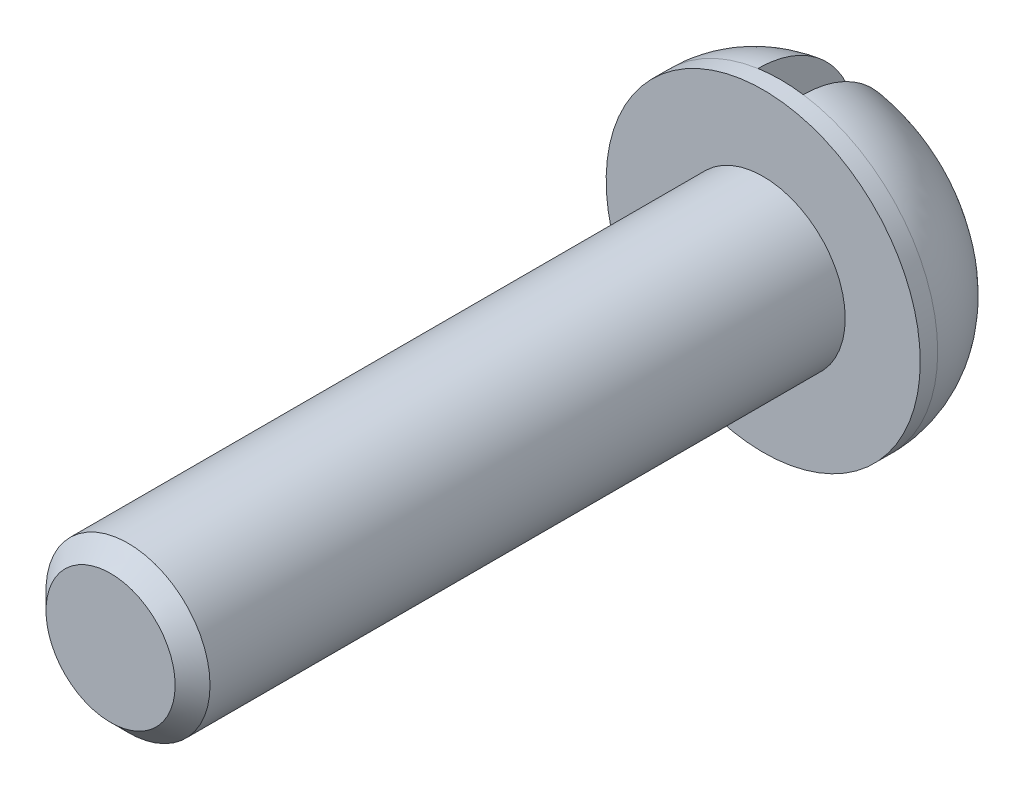
ISO-10303-21;
HEADER;
FILE_DESCRIPTION(('STEP AP214'),'2;1');
FILE_NAME('part.step','',(''),(''),'','','');
FILE_SCHEMA(('AUTOMOTIVE_DESIGN { 1 0 10303 214 1 1 1 1 }'));
ENDSEC;
DATA;
#1=APPLICATION_CONTEXT('core data for automotive mechanical design processes');
#2=APPLICATION_PROTOCOL_DEFINITION('international standard','automotive_design',2000,#1);
#3=PRODUCT_CONTEXT('',#1,'mechanical');
#4=PRODUCT('Part','Part','',(#3));
#5=PRODUCT_RELATED_PRODUCT_CATEGORY('part','',(#4));
#6=PRODUCT_DEFINITION_FORMATION('','',#4);
#7=PRODUCT_DEFINITION_CONTEXT('part definition',#1,'design');
#8=PRODUCT_DEFINITION('design','',#6,#7);
#9=PRODUCT_DEFINITION_SHAPE('','',#8);
#10=(LENGTH_UNIT() NAMED_UNIT(*) SI_UNIT(.MILLI.,.METRE.));
#11=(NAMED_UNIT(*) PLANE_ANGLE_UNIT() SI_UNIT($,.RADIAN.));
#12=(NAMED_UNIT(*) SI_UNIT($,.STERADIAN.) SOLID_ANGLE_UNIT());
#13=UNCERTAINTY_MEASURE_WITH_UNIT(LENGTH_MEASURE(1.E-05),#10,'distance_accuracy_value','');
#14=(GEOMETRIC_REPRESENTATION_CONTEXT(3) GLOBAL_UNCERTAINTY_ASSIGNED_CONTEXT((#13)) GLOBAL_UNIT_ASSIGNED_CONTEXT((#10,
#11,#12)) REPRESENTATION_CONTEXT('',''));
#15=CARTESIAN_POINT('',(0.,0.,0.));
#16=DIRECTION('',(0.,0.,1.));
#17=DIRECTION('',(1.,0.,0.));
#18=AXIS2_PLACEMENT_3D('',#15,#16,#17);
#19=CARTESIAN_POINT('',(0.,0.,0.));
#20=DIRECTION('',(0.,0.,1.));
#21=DIRECTION('',(1.,0.,0.));
#22=AXIS2_PLACEMENT_3D('',#19,#20,#21);
#23=PLANE('',#22);
#24=CARTESIAN_POINT('',(0.,0.,0.));
#25=DIRECTION('',(0.,0.,1.));
#26=DIRECTION('',(1.,0.,0.));
#27=AXIS2_PLACEMENT_3D('',#24,#25,#26);
#28=CIRCLE('',#27,1.7);
#29=CARTESIAN_POINT('',(-0.65,-1.5708278072405,0.));
#30=VERTEX_POINT('',#29);
#31=CARTESIAN_POINT('',(-0.65,1.5708278072405,0.));
#32=VERTEX_POINT('',#31);
#33=EDGE_CURVE('E100',#30,#32,#28,.F.);
#34=ORIENTED_EDGE('',*,*,#33,.T.);
#35=DIRECTION('',(0.,1.,0.));
#36=VECTOR('',#35,1.);
#37=CARTESIAN_POINT('',(-0.649999999999999,5.01710773037436,0.));
#38=LINE('',#37,#36);
#39=EDGE_CURVE('E90',#30,#32,#38,.T.);
#40=ORIENTED_EDGE('',*,*,#39,.F.);
#41=EDGE_LOOP('',(#34,#40));
#42=FACE_BOUND('',#41,.T.);
#43=ADVANCED_FACE('F45',(#42),#23,.F.);
#44=CARTESIAN_POINT('',(0.,0.,2.8));
#45=DIRECTION('',(0.,0.,1.));
#46=DIRECTION('',(1.,0.,0.));
#47=AXIS2_PLACEMENT_3D('',#44,#45,#46);
#48=DEGENERATE_TOROIDAL_SURFACE('',#47,1.7,2.8,.T.);
#49=CARTESIAN_POINT('',(-0.65,0.,0.204330529516518));
#50=CARTESIAN_POINT('',(-0.65,0.0279117837896374,0.204331087934366));
#51=CARTESIAN_POINT('',(-0.65,0.0558228971564562,0.203597110541377));
#52=CARTESIAN_POINT('',(-0.65,0.111575364540847,0.200734955072668));
#53=CARTESIAN_POINT('',(-0.65,0.139416708756462,0.198606591035097));
#54=CARTESIAN_POINT('',(-0.65,0.222849285232592,0.190391354619713));
#55=CARTESIAN_POINT('',(-0.65,0.278255780315076,0.182475354123906));
#56=CARTESIAN_POINT('',(-0.65,0.389405052110546,0.163770219803784));
#57=CARTESIAN_POINT('',(-0.65,0.445139999691246,0.152938972093485));
#58=CARTESIAN_POINT('',(-0.65,0.556417626954032,0.130466941404177));
#59=CARTESIAN_POINT('',(-0.65,0.611960375471304,0.11882648866782));
#60=CARTESIAN_POINT('',(-0.65,0.723233918642094,0.096077436262975));
#61=CARTESIAN_POINT('',(-0.65,0.77896486429416,0.0849695529680995));
#62=CARTESIAN_POINT('',(-0.65,0.890698592387891,0.0642013171293553));
#63=CARTESIAN_POINT('',(-0.65,0.946701358116122,0.0545408767218459));
#64=CARTESIAN_POINT('',(-0.65,1.05901660087995,0.0372616005583423));
#65=CARTESIAN_POINT('',(-0.65,1.11532901203785,0.0296423464750496));
#66=CARTESIAN_POINT('',(-0.65,1.22823025754123,0.0168393914026677));
#67=CARTESIAN_POINT('',(-0.65,1.28481909966129,0.0116557593181999));
#68=CARTESIAN_POINT('',(-0.649999999999999,1.45370229763085,0.00027211625048921));
#69=CARTESIAN_POINT('',(-0.65,1.56630309056038,-0.00195601816972203));
#70=CARTESIAN_POINT('',(-0.65,1.79114141144954,0.00554067481986287));
#71=CARTESIAN_POINT('',(-0.65,1.90337892249108,0.015266051099118));
#72=CARTESIAN_POINT('',(-0.65,2.09492538132553,0.0427167418326751));
#73=CARTESIAN_POINT('',(-0.649999999999999,2.17467039274206,0.0574465738207134));
#74=CARTESIAN_POINT('',(-0.649999999999999,2.33268200105975,0.0934145878866664));
#75=CARTESIAN_POINT('',(-0.649999999999999,2.41094830676893,0.114654037967693));
#76=CARTESIAN_POINT('',(-0.649999999999999,2.64324715184667,0.188304765014206));
#77=CARTESIAN_POINT('',(-0.649999999999999,2.7942929256106,0.250579913933112));
#78=CARTESIAN_POINT('',(-0.649999999999999,3.08348310789024,0.400022624468928));
#79=CARTESIAN_POINT('',(-0.649999999999999,3.22162540752624,0.487194245628106));
#80=CARTESIAN_POINT('',(-0.649999999999999,3.48063344120579,0.68398038974325));
#81=CARTESIAN_POINT('',(-0.649999999999999,3.60152202586923,0.79356475233629));
#82=CARTESIAN_POINT('',(-0.649999999999999,3.81958299652491,1.02898124095914));
#83=CARTESIAN_POINT('',(-0.649999999999999,3.91728542724759,1.1543229397608));
#84=CARTESIAN_POINT('',(-0.649999999999999,4.09000959206464,1.41982826511232));
#85=CARTESIAN_POINT('',(-0.649999999999999,4.16502506169916,1.55999597111359));
#86=CARTESIAN_POINT('',(-0.649999999999999,4.28936679221441,1.84938714379647));
#87=CARTESIAN_POINT('',(-0.649999999999999,4.33897752429503,1.99848846151491));
#88=CARTESIAN_POINT('',(-0.649999999999999,4.41234339605911,2.30290912318825));
#89=CARTESIAN_POINT('',(-0.649999999999999,4.43610137385542,2.45822778266266));
#90=CARTESIAN_POINT('',(-0.649999999999999,4.45703015449758,2.7700091908226));
#91=CARTESIAN_POINT('',(-0.649999999999999,4.45430863464563,2.92646472290166));
#92=CARTESIAN_POINT('',(-0.649999999999999,4.42261766872882,3.23668758234763));
#93=CARTESIAN_POINT('',(-0.649999999999999,4.39364941434615,3.39045503143866));
#94=CARTESIAN_POINT('',(-0.649999999999999,4.31034132645346,3.69082754898661));
#95=CARTESIAN_POINT('',(-0.649999999999999,4.25602082394701,3.83743798072508));
#96=CARTESIAN_POINT('',(-0.649999999999999,4.12357775281915,4.11951641704203));
#97=CARTESIAN_POINT('',(-0.649999999999999,4.04545013210249,4.25498204883217));
#98=CARTESIAN_POINT('',(-0.649999999999999,3.86743713578594,4.51127299241697));
#99=CARTESIAN_POINT('',(-0.649999999999999,3.76749755087739,4.63206063934133));
#100=CARTESIAN_POINT('',(-0.649999999999999,3.54894900878556,4.85518744521845));
#101=CARTESIAN_POINT('',(-0.649999999999999,3.43035335282762,4.9575396374253));
#102=CARTESIAN_POINT('',(-0.649999999999999,3.17710133722307,5.14174949027032));
#103=CARTESIAN_POINT('',(-0.649999999999999,3.04235071858958,5.22347728116295));
#104=CARTESIAN_POINT('',(-0.649999999999999,2.76087650725441,5.36375822882419));
#105=CARTESIAN_POINT('',(-0.649999999999999,2.61412863889647,5.42226292177923));
#106=CARTESIAN_POINT('',(-0.649999999999999,2.38705074607265,5.49205937434418));
#107=CARTESIAN_POINT('',(-0.649999999999999,2.30939114839431,5.51244097602119));
#108=CARTESIAN_POINT('',(-0.649999999999999,2.1526771745104,5.54681993477708));
#109=CARTESIAN_POINT('',(-0.65,2.07362321099464,5.5608191489761));
#110=CARTESIAN_POINT('',(-0.65,1.91503056711211,5.58244002672942));
#111=CARTESIAN_POINT('',(-0.65,1.83549580972397,5.59009083636058));
#112=CARTESIAN_POINT('',(-0.65,1.67609799062975,5.59930257984155));
#113=CARTESIAN_POINT('',(-0.65,1.59623500959051,5.60086492978602));
#114=CARTESIAN_POINT('',(-0.65,1.43959066671686,5.59828619412824));
#115=CARTESIAN_POINT('',(-0.65,1.3628053902994,5.59435551211281));
#116=CARTESIAN_POINT('',(-0.65,1.20968432344499,5.58166418880198));
#117=CARTESIAN_POINT('',(-0.65,1.13334833613665,5.57290585148777));
#118=CARTESIAN_POINT('',(-0.65,0.981018168726281,5.5513459538168));
#119=CARTESIAN_POINT('',(-0.65,0.9050258644384,5.53853154314831));
#120=CARTESIAN_POINT('',(-0.65,0.753433020233272,5.51021024306605));
#121=CARTESIAN_POINT('',(-0.65,0.677833384505429,5.4946987380632));
#122=CARTESIAN_POINT('',(-0.65,0.564176676143863,5.47124790715525));
#123=CARTESIAN_POINT('',(-0.65,0.526106829773408,5.46337086573171));
#124=CARTESIAN_POINT('',(-0.65,0.449877912792236,5.44807647256468));
#125=CARTESIAN_POINT('',(-0.65,0.411718833890828,5.44065916545218));
#126=CARTESIAN_POINT('',(-0.65,0.297233474050782,5.4200934973403));
#127=CARTESIAN_POINT('',(-0.65,0.220555420428561,5.40854924859761));
#128=CARTESIAN_POINT('',(-0.65,0.104710806565111,5.39862217403233));
#129=CARTESIAN_POINT('',(-0.65,0.0658833020309873,5.3965478376567));
#130=CARTESIAN_POINT('',(-0.65,-0.0118156181124019,5.39524558825786));
#131=CARTESIAN_POINT('',(-0.65,-0.0506870263295294,5.39601725181112));
#132=CARTESIAN_POINT('',(-0.65,-0.128429900278693,5.40027292117363));
#133=CARTESIAN_POINT('',(-0.65,-0.167300730895887,5.40376788003507));
#134=CARTESIAN_POINT('',(-0.65,-0.244791377715604,5.41290679467957));
#135=CARTESIAN_POINT('',(-0.65,-0.28341109314006,5.4185515648908));
#136=CARTESIAN_POINT('',(-0.65,-0.392359721227225,5.43648935259769));
#137=CARTESIAN_POINT('',(-0.65,-0.462405675745249,5.45041202969674));
#138=CARTESIAN_POINT('',(-0.65,-0.602330290887419,5.47902438193602));
#139=CARTESIAN_POINT('',(-0.65,-0.672208911370984,5.49371422493339));
#140=CARTESIAN_POINT('',(-0.65,-0.812191590209405,5.52146708493826));
#141=CARTESIAN_POINT('',(-0.65,-0.882295107999363,5.53453267069043));
#142=CARTESIAN_POINT('',(-0.65,-1.02299077260088,5.55767447265196));
#143=CARTESIAN_POINT('',(-0.65,-1.09358279848025,5.56775140340544));
#144=CARTESIAN_POINT('',(-0.65,-1.23464844805872,5.58401394702837));
#145=CARTESIAN_POINT('',(-0.65,-1.30511843589948,5.59023028489063));
#146=CARTESIAN_POINT('',(-0.65,-1.44632144043651,5.59838476206285));
#147=CARTESIAN_POINT('',(-0.65,-1.51705448688793,5.60032240168588));
#148=CARTESIAN_POINT('',(-0.65,-1.65860196223128,5.59958933103074));
#149=CARTESIAN_POINT('',(-0.65,-1.72941636688346,5.59691218356284));
#150=CARTESIAN_POINT('',(-0.65,-1.87069757192823,5.58673580669473));
#151=CARTESIAN_POINT('',(-0.65,-1.94116437814897,5.57923665842343));
#152=CARTESIAN_POINT('',(-0.65,-2.09049340011581,5.55800711036983));
#153=CARTESIAN_POINT('',(-0.65,-2.16926080637245,5.54359540904285));
#154=CARTESIAN_POINT('',(-0.65,-2.32526739618395,5.50844787320665));
#155=CARTESIAN_POINT('',(-0.65,-2.40250802440952,5.48771835507101));
#156=CARTESIAN_POINT('',(-0.65,-2.63317056294659,5.4154488361604));
#157=CARTESIAN_POINT('',(-0.65,-2.78365823997052,5.35408845072101));
#158=CARTESIAN_POINT('',(-0.65,-3.0716602423947,5.20685270163376));
#159=CARTESIAN_POINT('',(-0.65,-3.20920041958005,5.1210276287806));
#160=CARTESIAN_POINT('',(-0.65,-3.46692156581066,4.92753363022395));
#161=CARTESIAN_POINT('',(-0.65,-3.58718524694266,4.81997515312549));
#162=CARTESIAN_POINT('',(-0.65,-3.80577883649485,4.58758994399158));
#163=CARTESIAN_POINT('',(-0.65,-3.90441427808099,4.46305045607964));
#164=CARTESIAN_POINT('',(-0.65,-4.07925126881427,4.19881518613118));
#165=CARTESIAN_POINT('',(-0.65,-4.15541729244024,4.05909587597104));
#166=CARTESIAN_POINT('',(-0.65,-4.28204630159045,3.77047360593635));
#167=CARTESIAN_POINT('',(-0.65,-4.33280794886233,3.62170159644235));
#168=CARTESIAN_POINT('',(-0.65,-4.40849150531023,3.31779997918635));
#169=CARTESIAN_POINT('',(-0.65,-4.43342650205663,3.16267363293593));
#170=CARTESIAN_POINT('',(-0.65,-4.4567218846325,2.85107244616185));
#171=CARTESIAN_POINT('',(-0.65,-4.45518943830652,2.69460560652868));
#172=CARTESIAN_POINT('',(-0.65,-4.4258557153541,2.38413551909046));
#173=CARTESIAN_POINT('',(-0.65,-4.39805143342681,2.2301325551839));
#174=CARTESIAN_POINT('',(-0.65,-4.31701099744031,1.92910295750259));
#175=CARTESIAN_POINT('',(-0.65,-4.26379492623196,1.78207091532762));
#176=CARTESIAN_POINT('',(-0.65,-4.13348552775416,1.49900569277873));
#177=CARTESIAN_POINT('',(-0.65,-4.05639270873031,1.36297227836337));
#178=CARTESIAN_POINT('',(-0.65,-3.8803671284891,1.10541606456842));
#179=CARTESIAN_POINT('',(-0.65,-3.78138604381101,0.983926302988356));
#180=CARTESIAN_POINT('',(-0.65,-3.5645553620557,0.75916860268908));
#181=CARTESIAN_POINT('',(-0.65,-3.44670685834014,0.655899608809962));
#182=CARTESIAN_POINT('',(-0.65,-3.19473731500021,0.469719759068232));
#183=CARTESIAN_POINT('',(-0.65,-3.06051541726674,0.386945690982017));
#184=CARTESIAN_POINT('',(-0.65,-2.78013937877912,0.24464347405776));
#185=CARTESIAN_POINT('',(-0.65,-2.63398016830355,0.185125264595288));
#186=CARTESIAN_POINT('',(-0.65,-2.40773053086942,0.113762414740906));
#187=CARTESIAN_POINT('',(-0.65,-2.33037662368006,0.0928504515872156));
#188=CARTESIAN_POINT('',(-0.65,-2.17423016064795,0.0573863519268674));
#189=CARTESIAN_POINT('',(-0.65,-2.09543803413488,0.0428323488038696));
#190=CARTESIAN_POINT('',(-0.65,-1.93710907518408,0.0200586793184042));
#191=CARTESIAN_POINT('',(-0.65,-1.85757396298509,0.0118269050165051));
#192=CARTESIAN_POINT('',(-0.65,-1.69813173729819,0.00148527811640662));
#193=CARTESIAN_POINT('',(-0.65,-1.61822473386984,-0.000626283034067639));
#194=CARTESIAN_POINT('',(-0.65,-1.47391075968334,0.000794936248612849));
#195=CARTESIAN_POINT('',(-0.65,-1.40949030611767,0.00331651922976186));
#196=CARTESIAN_POINT('',(-0.65,-1.28088761647228,0.01185989054035));
#197=CARTESIAN_POINT('',(-0.65,-1.21670537228828,0.0178815586719182));
#198=CARTESIAN_POINT('',(-0.65,-1.08836543453608,0.0330587123296681));
#199=CARTESIAN_POINT('',(-0.65,-1.02420978962779,0.0422311342191122));
#200=CARTESIAN_POINT('',(-0.65,-0.896329220916162,0.0630650966075091));
#201=CARTESIAN_POINT('',(-0.65,-0.832604204598304,0.0747260837212804));
#202=CARTESIAN_POINT('',(-0.65,-0.704844825132041,0.0996569261489211));
#203=CARTESIAN_POINT('',(-0.65,-0.640813352262589,0.112941132372526));
#204=CARTESIAN_POINT('',(-0.65,-0.51265890642737,0.139384927081313));
#205=CARTESIAN_POINT('',(-0.65,-0.448535908021505,0.15254436992915));
#206=CARTESIAN_POINT('',(-0.65,-0.320628561545134,0.175853199198758));
#207=CARTESIAN_POINT('',(-0.65,-0.256852549491517,0.186043054816712));
#208=CARTESIAN_POINT('',(-0.65,-0.160728738253536,0.196757182513252));
#209=CARTESIAN_POINT('',(-0.65,-0.128647304162951,0.199566179812943));
#210=CARTESIAN_POINT('',(-0.65,-0.0643769383673947,0.203352394893405));
#211=CARTESIAN_POINT('',(-0.65,-0.0321880233917454,0.204329885545967));
#212=CARTESIAN_POINT('',(-0.65,0.,0.204330529516518));
#213=B_SPLINE_CURVE_WITH_KNOTS('',3,(#49,#50,#51,#52,#53,#54,#55,#56,#57,#58,#59,#60,#61,#62,
#63,#64,#65,#66,#67,#68,#69,#70,#71,#72,#73,#74,#75,#76,#77,#78,#79,#80,#81,#82,#83,#84,#85,#86,
#87,#88,#89,#90,#91,#92,#93,#94,#95,#96,#97,#98,#99,#100,#101,#102,#103,#104,#105,#106,#107,
#108,#109,#110,#111,#112,#113,#114,#115,#116,#117,#118,#119,#120,#121,#122,#123,#124,#125,#126,
#127,#128,#129,#130,#131,#132,#133,#134,#135,#136,#137,#138,#139,#140,#141,#142,#143,#144,#145,
#146,#147,#148,#149,#150,#151,#152,#153,#154,#155,#156,#157,#158,#159,#160,#161,#162,#163,#164,
#165,#166,#167,#168,#169,#170,#171,#172,#173,#174,#175,#176,#177,#178,#179,#180,#181,#182,#183,
#184,#185,#186,#187,#188,#189,#190,#191,#192,#193,#194,#195,#196,#197,#198,#199,#200,#201,#202,
#203,#204,#205,#206,#207,#208,#209,#210,#211,#212),.UNSPECIFIED.,.T.,.F.,(4,2,2,2,2,2,2,2,2,2,2,
2,2,2,2,2,2,2,2,2,2,2,2,2,2,2,2,2,2,2,2,2,2,2,2,2,2,2,2,2,2,2,2,2,2,2,2,2,2,2,2,2,2,2,2,2,2,2,2,
2,2,2,2,2,2,2,2,2,2,2,2,2,2,2,2,2,2,2,2,2,2,4),(0.,0.0837252526420583,0.167461673544681,
0.335213226754073,0.505531888994438,0.675781446407129,0.846253930806523,1.01671606287576,
1.18714323311481,1.35757522450948,1.69483598625099,2.03211223457649,2.2751260238936,
2.51818717978259,3.00576570975314,3.4934237882152,3.98042990270964,4.4549092701746,
4.92951953436033,5.39869225449552,5.86781346369708,6.33502781927595,6.80222096295391,
7.26905845397962,7.73599508140094,8.20410567699579,8.67188402377214,9.14253828617038,
9.61416964772726,9.85481743526719,10.0953951553702,10.3348621534584,10.5742734513867,
10.8047616018187,11.0351398477269,11.2662554012872,11.4977704315665,11.6143945856016,
11.7310300438269,11.9632407116654,12.0797906587688,12.1963232664482,12.3133270010746,
12.4303751052118,12.6445603811045,12.8587927190469,13.0726818202364,13.2865197423392,
13.4986332359242,13.7107714998318,13.9232059159823,14.1356367580725,14.3755831926812,
14.6152905182553,15.100315414871,15.5843503733931,16.0659846963764,16.5403001396387,
17.0153615341079,17.4846984460279,17.953797406474,18.4209974114255,18.8882508670229,
19.3551356634036,19.8220105222569,20.2899265938076,20.7578155595608,21.2287478898892,
21.6998812735013,21.9400531280347,22.180154423696,22.4197947376911,22.6593681459352,
22.8526794249366,23.0459840657477,23.2403444797859,23.4346617186213,23.6308416605635,
23.8272277752196,24.0207968896553,24.1173637023255,24.2139161265931),.UNSPECIFIED.);
#214=CARTESIAN_POINT('',(-0.649999999999999,4.45280810275943,2.8));
#215=VERTEX_POINT('',#214);
#216=EDGE_CURVE('E96',#32,#215,#213,.T.);
#217=ORIENTED_EDGE('',*,*,#216,.F.);
#218=ORIENTED_EDGE('',*,*,#33,.F.);
#219=CARTESIAN_POINT('',(-0.65,-4.45280810275943,2.8));
#220=VERTEX_POINT('',#219);
#221=EDGE_CURVE('E87',#220,#30,#213,.T.);
#222=ORIENTED_EDGE('',*,*,#221,.F.);
#223=CARTESIAN_POINT('',(0.,0.,2.8));
#224=DIRECTION('',(0.,0.,1.));
#225=DIRECTION('',(1.,0.,0.));
#226=AXIS2_PLACEMENT_3D('',#223,#224,#225);
#227=CIRCLE('',#226,4.5);
#228=EDGE_CURVE('E282',#215,#220,#227,.T.);
#229=ORIENTED_EDGE('',*,*,#228,.F.);
#230=EDGE_LOOP('',(#217,#218,#222,#229));
#231=FACE_BOUND('',#230,.T.);
#232=ADVANCED_FACE('F103',(#231),#48,.T.);
#233=CARTESIAN_POINT('',(0.,0.,3.3));
#234=DIRECTION('',(0.,0.,-1.));
#235=DIRECTION('',(-1.,0.,0.));
#236=AXIS2_PLACEMENT_3D('',#233,#234,#235);
#237=CYLINDRICAL_SURFACE('',#236,4.5);
#238=CARTESIAN_POINT('',(0.650000000000001,4.45280810275943,2.8));
#239=VERTEX_POINT('',#238);
#240=EDGE_CURVE('E109',#239,#215,#227,.T.);
#241=ORIENTED_EDGE('',*,*,#240,.T.);
#242=ORIENTED_EDGE('',*,*,#228,.T.);
#243=CARTESIAN_POINT('',(0.65,-4.45280810275943,2.8));
#244=VERTEX_POINT('',#243);
#245=EDGE_CURVE('E284',#220,#244,#227,.T.);
#246=ORIENTED_EDGE('',*,*,#245,.T.);
#247=EDGE_CURVE('E287',#244,#239,#227,.T.);
#248=ORIENTED_EDGE('',*,*,#247,.T.);
#249=EDGE_LOOP('',(#241,#242,#246,#248));
#250=FACE_BOUND('',#249,.T.);
#251=CARTESIAN_POINT('',(0.,0.,3.3));
#252=DIRECTION('',(0.,0.,1.));
#253=DIRECTION('',(1.,0.,0.));
#254=AXIS2_PLACEMENT_3D('',#251,#252,#253);
#255=CIRCLE('',#254,4.5);
#256=CARTESIAN_POINT('',(4.5,0.,3.3));
#257=VERTEX_POINT('',#256);
#258=EDGE_CURVE('E288',#257,#257,#255,.T.);
#259=ORIENTED_EDGE('',*,*,#258,.F.);
#260=EDGE_LOOP('',(#259));
#261=FACE_BOUND('',#260,.T.);
#262=ADVANCED_FACE('F143',(#250,#261),#237,.T.);
#263=CARTESIAN_POINT('',(0.,0.,3.3));
#264=DIRECTION('',(0.,0.,1.));
#265=DIRECTION('',(1.,0.,0.));
#266=AXIS2_PLACEMENT_3D('',#263,#264,#265);
#267=PLANE('',#266);
#268=CARTESIAN_POINT('',(0.,0.,3.3));
#269=DIRECTION('',(0.,0.,1.));
#270=DIRECTION('',(1.,0.,0.));
#271=AXIS2_PLACEMENT_3D('',#268,#269,#270);
#272=CIRCLE('',#271,2.35);
#273=CARTESIAN_POINT('',(2.35,0.,3.3));
#274=VERTEX_POINT('',#273);
#275=EDGE_CURVE('E290',#274,#274,#272,.F.);
#276=ORIENTED_EDGE('',*,*,#275,.T.);
#277=EDGE_LOOP('',(#276));
#278=FACE_BOUND('',#277,.T.);
#279=ORIENTED_EDGE('',*,*,#258,.T.);
#280=EDGE_LOOP('',(#279));
#281=FACE_BOUND('',#280,.T.);
#282=ADVANCED_FACE('F140',(#278,#281),#267,.T.);
#283=CARTESIAN_POINT('',(0.65,1.5708278072405,0.));
#284=VERTEX_POINT('',#283);
#285=CARTESIAN_POINT('',(0.65,-1.5708278072405,0.));
#286=VERTEX_POINT('',#285);
#287=EDGE_CURVE('E105',#284,#286,#28,.F.);
#288=ORIENTED_EDGE('',*,*,#287,.T.);
#289=DIRECTION('',(0.,-1.,0.));
#290=VECTOR('',#289,1.);
#291=CARTESIAN_POINT('',(0.650000000000001,5.01710773037436,0.));
#292=LINE('',#291,#290);
#293=EDGE_CURVE('E101',#284,#286,#292,.T.);
#294=ORIENTED_EDGE('',*,*,#293,.F.);
#295=EDGE_LOOP('',(#288,#294));
#296=FACE_BOUND('',#295,.T.);
#297=ADVANCED_FACE('F138',(#296),#23,.F.);
#298=CARTESIAN_POINT('',(0.,0.,22.));
#299=DIRECTION('',(0.,0.,-1.));
#300=DIRECTION('',(-1.,0.,0.));
#301=AXIS2_PLACEMENT_3D('',#298,#299,#300);
#302=CYLINDRICAL_SURFACE('',#301,2.35);
#303=CARTESIAN_POINT('',(0.,0.,21.5));
#304=DIRECTION('',(0.,0.,1.));
#305=DIRECTION('',(1.,0.,0.));
#306=AXIS2_PLACEMENT_3D('',#303,#304,#305);
#307=CIRCLE('',#306,2.35);
#308=CARTESIAN_POINT('',(2.35,0.,21.5));
#309=VERTEX_POINT('',#308);
#310=EDGE_CURVE('E11',#309,#309,#307,.F.);
#311=ORIENTED_EDGE('',*,*,#310,.T.);
#312=EDGE_LOOP('',(#311));
#313=FACE_BOUND('',#312,.T.);
#314=ORIENTED_EDGE('',*,*,#275,.F.);
#315=EDGE_LOOP('',(#314));
#316=FACE_BOUND('',#315,.T.);
#317=ADVANCED_FACE('F134',(#313,#316),#302,.T.);
#318=CARTESIAN_POINT('',(0.,0.,22.));
#319=DIRECTION('',(0.,0.,1.));
#320=DIRECTION('',(1.,0.,0.));
#321=AXIS2_PLACEMENT_3D('',#318,#319,#320);
#322=PLANE('',#321);
#323=CARTESIAN_POINT('',(0.,0.,22.));
#324=DIRECTION('',(0.,0.,1.));
#325=DIRECTION('',(1.,0.,0.));
#326=AXIS2_PLACEMENT_3D('',#323,#324,#325);
#327=CIRCLE('',#326,1.85);
#328=CARTESIAN_POINT('',(1.85,0.,22.));
#329=VERTEX_POINT('',#328);
#330=EDGE_CURVE('E54',#329,#329,#327,.T.);
#331=ORIENTED_EDGE('',*,*,#330,.T.);
#332=EDGE_LOOP('',(#331));
#333=FACE_BOUND('',#332,.T.);
#334=ADVANCED_FACE('F131',(#333),#322,.T.);
#335=CARTESIAN_POINT('',(0.65,0.,0.204330529516518));
#336=CARTESIAN_POINT('',(0.65,-0.0279117837896375,0.204331087934366));
#337=CARTESIAN_POINT('',(0.65,-0.0558228971564563,0.203597110541377));
#338=CARTESIAN_POINT('',(0.65,-0.111575364540847,0.200734955072668));
#339=CARTESIAN_POINT('',(0.65,-0.139416708756462,0.198606591035097));
#340=CARTESIAN_POINT('',(0.65,-0.222849285232592,0.190391354619713));
#341=CARTESIAN_POINT('',(0.65,-0.278255780315076,0.182475354123906));
#342=CARTESIAN_POINT('',(0.65,-0.389405052110546,0.163770219803784));
#343=CARTESIAN_POINT('',(0.65,-0.445139999691246,0.152938972093485));
#344=CARTESIAN_POINT('',(0.65,-0.556417626954033,0.130466941404176));
#345=CARTESIAN_POINT('',(0.65,-0.611960375471305,0.11882648866782));
#346=CARTESIAN_POINT('',(0.65,-0.723233918642095,0.0960774362629744));
#347=CARTESIAN_POINT('',(0.65,-0.778964864294161,0.0849695529680992));
#348=CARTESIAN_POINT('',(0.65,-0.890698592387892,0.0642013171293554));
#349=CARTESIAN_POINT('',(0.65,-0.946701358116123,0.0545408767218463));
#350=CARTESIAN_POINT('',(0.65,-1.05901660087995,0.0372616005583424));
#351=CARTESIAN_POINT('',(0.65,-1.11532901203785,0.0296423464750492));
#352=CARTESIAN_POINT('',(0.65,-1.22823025754124,0.016839391402667));
#353=CARTESIAN_POINT('',(0.65,-1.28481909966129,0.0116557593181993));
#354=CARTESIAN_POINT('',(0.65,-1.45370229763085,0.000272116250489012));
#355=CARTESIAN_POINT('',(0.65,-1.56630309056038,-0.0019560181697218));
#356=CARTESIAN_POINT('',(0.65,-1.79114141144954,0.00554067481986321));
#357=CARTESIAN_POINT('',(0.65,-1.90337892249108,0.0152660510991181));
#358=CARTESIAN_POINT('',(0.65,-2.09492538132553,0.0427167418326755));
#359=CARTESIAN_POINT('',(0.65,-2.17467039274207,0.0574465738207141));
#360=CARTESIAN_POINT('',(0.65,-2.33268200105975,0.0934145878866674));
#361=CARTESIAN_POINT('',(0.65,-2.41094830676894,0.114654037967694));
#362=CARTESIAN_POINT('',(0.65,-2.64324715184667,0.188304765014207));
#363=CARTESIAN_POINT('',(0.65,-2.79429292561061,0.250579913933114));
#364=CARTESIAN_POINT('',(0.65,-3.08348310789024,0.400022624468929));
#365=CARTESIAN_POINT('',(0.65,-3.22162540752624,0.487194245628108));
#366=CARTESIAN_POINT('',(0.65,-3.48063344120579,0.683980389743252));
#367=CARTESIAN_POINT('',(0.65,-3.60152202586923,0.793564752336292));
#368=CARTESIAN_POINT('',(0.65,-3.81958299652491,1.02898124095915));
#369=CARTESIAN_POINT('',(0.65,-3.91728542724759,1.1543229397608));
#370=CARTESIAN_POINT('',(0.65,-4.09000959206465,1.41982826511233));
#371=CARTESIAN_POINT('',(0.65,-4.16502506169916,1.55999597111359));
#372=CARTESIAN_POINT('',(0.65,-4.28936679221441,1.84938714379647));
#373=CARTESIAN_POINT('',(0.65,-4.33897752429504,1.99848846151492));
#374=CARTESIAN_POINT('',(0.65,-4.41234339605911,2.30290912318825));
#375=CARTESIAN_POINT('',(0.65,-4.43610137385542,2.45822778266266));
#376=CARTESIAN_POINT('',(0.65,-4.45703015449758,2.7700091908226));
#377=CARTESIAN_POINT('',(0.65,-4.45430863464563,2.92646472290166));
#378=CARTESIAN_POINT('',(0.65,-4.42261766872882,3.23668758234763));
#379=CARTESIAN_POINT('',(0.65,-4.39364941434615,3.39045503143866));
#380=CARTESIAN_POINT('',(0.65,-4.31034132645346,3.69082754898662));
#381=CARTESIAN_POINT('',(0.65,-4.25602082394701,3.83743798072508));
#382=CARTESIAN_POINT('',(0.65,-4.12357775281915,4.11951641704203));
#383=CARTESIAN_POINT('',(0.65,-4.04545013210249,4.25498204883217));
#384=CARTESIAN_POINT('',(0.65,-3.86743713578594,4.51127299241697));
#385=CARTESIAN_POINT('',(0.65,-3.76749755087739,4.63206063934133));
#386=CARTESIAN_POINT('',(0.65,-3.54894900878556,4.85518744521845));
#387=CARTESIAN_POINT('',(0.65,-3.43035335282761,4.9575396374253));
#388=CARTESIAN_POINT('',(0.65,-3.17710133722307,5.14174949027032));
#389=CARTESIAN_POINT('',(0.65,-3.04235071858958,5.22347728116295));
#390=CARTESIAN_POINT('',(0.65,-2.7608765072544,5.36375822882419));
#391=CARTESIAN_POINT('',(0.65,-2.61412863889646,5.42226292177923));
#392=CARTESIAN_POINT('',(0.65,-2.38705074607265,5.49205937434418));
#393=CARTESIAN_POINT('',(0.65,-2.30939114839431,5.51244097602119));
#394=CARTESIAN_POINT('',(0.65,-2.1526771745104,5.54681993477708));
#395=CARTESIAN_POINT('',(0.65,-2.07362321099463,5.5608191489761));
#396=CARTESIAN_POINT('',(0.65,-1.9150305671121,5.58244002672943));
#397=CARTESIAN_POINT('',(0.65,-1.83549580972396,5.59009083636058));
#398=CARTESIAN_POINT('',(0.65,-1.67609799062974,5.59930257984155));
#399=CARTESIAN_POINT('',(0.65,-1.5962350095905,5.60086492978602));
#400=CARTESIAN_POINT('',(0.65,-1.43959066671686,5.59828619412824));
#401=CARTESIAN_POINT('',(0.65,-1.3628053902994,5.59435551211281));
#402=CARTESIAN_POINT('',(0.65,-1.20968432344498,5.58166418880198));
#403=CARTESIAN_POINT('',(0.65,-1.13334833613665,5.57290585148777));
#404=CARTESIAN_POINT('',(0.65,-0.981018168726272,5.5513459538168));
#405=CARTESIAN_POINT('',(0.65,-0.90502586443839,5.5385315431483));
#406=CARTESIAN_POINT('',(0.65,-0.753433020233261,5.51021024306604));
#407=CARTESIAN_POINT('',(0.65,-0.677833384505417,5.4946987380632));
#408=CARTESIAN_POINT('',(0.65,-0.564176676143848,5.47124790715524));
#409=CARTESIAN_POINT('',(0.65,-0.526106829773392,5.4633708657317));
#410=CARTESIAN_POINT('',(0.65,-0.449877912792219,5.44807647256468));
#411=CARTESIAN_POINT('',(0.65,-0.411718833890811,5.44065916545218));
#412=CARTESIAN_POINT('',(0.65,-0.297233474050764,5.4200934973403));
#413=CARTESIAN_POINT('',(0.65,-0.220555420428542,5.40854924859761));
#414=CARTESIAN_POINT('',(0.65,-0.104710806565091,5.39862217403233));
#415=CARTESIAN_POINT('',(0.65,-0.0658833020309668,5.3965478376567));
#416=CARTESIAN_POINT('',(0.65,0.0118156181124232,5.39524558825786));
#417=CARTESIAN_POINT('',(0.65,0.0506870263295506,5.39601725181112));
#418=CARTESIAN_POINT('',(0.65,0.128429900278716,5.40027292117363));
#419=CARTESIAN_POINT('',(0.65,0.167300730895911,5.40376788003507));
#420=CARTESIAN_POINT('',(0.65,0.244791377715629,5.41290679467957));
#421=CARTESIAN_POINT('',(0.65,0.283411093140084,5.4185515648908));
#422=CARTESIAN_POINT('',(0.65,0.392359721227249,5.43648935259769));
#423=CARTESIAN_POINT('',(0.65,0.462405675745272,5.45041202969674));
#424=CARTESIAN_POINT('',(0.65,0.602330290887441,5.47902438193602));
#425=CARTESIAN_POINT('',(0.65,0.672208911371006,5.49371422493339));
#426=CARTESIAN_POINT('',(0.65,0.812191590209426,5.52146708493827));
#427=CARTESIAN_POINT('',(0.65,0.882295107999383,5.53453267069044));
#428=CARTESIAN_POINT('',(0.65,1.0229907726009,5.55767447265196));
#429=CARTESIAN_POINT('',(0.65,1.09358279848027,5.56775140340544));
#430=CARTESIAN_POINT('',(0.65,1.23464844805874,5.58401394702837));
#431=CARTESIAN_POINT('',(0.65,1.30511843589949,5.59023028489063));
#432=CARTESIAN_POINT('',(0.65,1.44632144043653,5.59838476206285));
#433=CARTESIAN_POINT('',(0.65,1.51705448688794,5.60032240168588));
#434=CARTESIAN_POINT('',(0.65,1.6586019622313,5.59958933103074));
#435=CARTESIAN_POINT('',(0.65,1.72941636688348,5.59691218356284));
#436=CARTESIAN_POINT('',(0.65,1.87069757192824,5.58673580669473));
#437=CARTESIAN_POINT('',(0.65,1.94116437814898,5.57923665842343));
#438=CARTESIAN_POINT('',(0.65,2.09049340011582,5.55800711036983));
#439=CARTESIAN_POINT('',(0.65,2.16926080637246,5.54359540904284));
#440=CARTESIAN_POINT('',(0.65,2.32526739618396,5.50844787320664));
#441=CARTESIAN_POINT('',(0.65,2.40250802440953,5.48771835507101));
#442=CARTESIAN_POINT('',(0.65,2.6331705629466,5.4154488361604));
#443=CARTESIAN_POINT('',(0.650000000000001,2.78365823997053,5.35408845072101));
#444=CARTESIAN_POINT('',(0.650000000000001,3.07166024239472,5.20685270163375));
#445=CARTESIAN_POINT('',(0.650000000000001,3.20920041958006,5.1210276287806));
#446=CARTESIAN_POINT('',(0.650000000000001,3.46692156581066,4.92753363022394));
#447=CARTESIAN_POINT('',(0.650000000000001,3.58718524694267,4.81997515312548));
#448=CARTESIAN_POINT('',(0.650000000000001,3.80577883649486,4.58758994399157));
#449=CARTESIAN_POINT('',(0.650000000000001,3.904414278081,4.46305045607963));
#450=CARTESIAN_POINT('',(0.650000000000001,4.07925126881427,4.19881518613117));
#451=CARTESIAN_POINT('',(0.650000000000001,4.15541729244024,4.05909587597103));
#452=CARTESIAN_POINT('',(0.650000000000001,4.28204630159046,3.77047360593634));
#453=CARTESIAN_POINT('',(0.650000000000001,4.33280794886233,3.62170159644233));
#454=CARTESIAN_POINT('',(0.650000000000001,4.40849150531023,3.31779997918634));
#455=CARTESIAN_POINT('',(0.650000000000001,4.43342650205664,3.16267363293591));
#456=CARTESIAN_POINT('',(0.650000000000001,4.4567218846325,2.85107244616184));
#457=CARTESIAN_POINT('',(0.650000000000001,4.45518943830652,2.69460560652867));
#458=CARTESIAN_POINT('',(0.650000000000001,4.4258557153541,2.38413551909044));
#459=CARTESIAN_POINT('',(0.650000000000001,4.39805143342681,2.23013255518389));
#460=CARTESIAN_POINT('',(0.650000000000001,4.3170109974403,1.92910295750258));
#461=CARTESIAN_POINT('',(0.650000000000001,4.26379492623196,1.7820709153276));
#462=CARTESIAN_POINT('',(0.650000000000001,4.13348552775416,1.49900569277872));
#463=CARTESIAN_POINT('',(0.650000000000001,4.0563927087303,1.36297227836336));
#464=CARTESIAN_POINT('',(0.650000000000001,3.88036712848909,1.10541606456841));
#465=CARTESIAN_POINT('',(0.650000000000001,3.781386043811,0.983926302988346));
#466=CARTESIAN_POINT('',(0.650000000000001,3.56455536205569,0.759168602689071));
#467=CARTESIAN_POINT('',(0.650000000000001,3.44670685834013,0.655899608809955));
#468=CARTESIAN_POINT('',(0.650000000000001,3.1947373150002,0.469719759068226));
#469=CARTESIAN_POINT('',(0.65,3.06051541726673,0.386945690982011));
#470=CARTESIAN_POINT('',(0.65,2.78013937877911,0.244643474057755));
#471=CARTESIAN_POINT('',(0.65,2.63398016830354,0.185125264595284));
#472=CARTESIAN_POINT('',(0.65,2.40773053086941,0.113762414740902));
#473=CARTESIAN_POINT('',(0.65,2.33037662368004,0.0928504515872119));
#474=CARTESIAN_POINT('',(0.65,2.17423016064793,0.0573863519268642));
#475=CARTESIAN_POINT('',(0.65,2.09543803413487,0.0428323488038667));
#476=CARTESIAN_POINT('',(0.65,1.93710907518407,0.0200586793184024));
#477=CARTESIAN_POINT('',(0.65,1.85757396298508,0.0118269050165041));
#478=CARTESIAN_POINT('',(0.65,1.69813173729818,0.00148527811640628));
#479=CARTESIAN_POINT('',(0.65,1.61822473386983,-0.000626283034068254));
#480=CARTESIAN_POINT('',(0.65,1.47391075968332,0.00079493624861284));
#481=CARTESIAN_POINT('',(0.65,1.40949030611765,0.00331651922976245));
#482=CARTESIAN_POINT('',(0.65,1.28088761647227,0.011859890540351));
#483=CARTESIAN_POINT('',(0.65,1.21670537228827,0.0178815586719191));
#484=CARTESIAN_POINT('',(0.65,1.08836543453607,0.0330587123296691));
#485=CARTESIAN_POINT('',(0.65,1.02420978962779,0.0422311342191133));
#486=CARTESIAN_POINT('',(0.65,0.896329220916154,0.0630650966075102));
#487=CARTESIAN_POINT('',(0.65,0.832604204598297,0.0747260837212814));
#488=CARTESIAN_POINT('',(0.65,0.704844825132035,0.0996569261489222));
#489=CARTESIAN_POINT('',(0.65,0.640813352262584,0.112941132372527));
#490=CARTESIAN_POINT('',(0.65,0.512658906427366,0.139384927081314));
#491=CARTESIAN_POINT('',(0.65,0.448535908021502,0.152544369929151));
#492=CARTESIAN_POINT('',(0.65,0.320628561545132,0.175853199198758));
#493=CARTESIAN_POINT('',(0.65,0.256852549491516,0.186043054816712));
#494=CARTESIAN_POINT('',(0.65,0.160728738253536,0.196757182513252));
#495=CARTESIAN_POINT('',(0.65,0.128647304162951,0.199566179812943));
#496=CARTESIAN_POINT('',(0.65,0.0643769383673947,0.203352394893406));
#497=CARTESIAN_POINT('',(0.65,0.0321880233917453,0.204329885545967));
#498=CARTESIAN_POINT('',(0.65,0.,0.204330529516518));
#499=B_SPLINE_CURVE_WITH_KNOTS('',3,(#335,#336,#337,#338,#339,#340,#341,#342,#343,#344,#345,
#346,#347,#348,#349,#350,#351,#352,#353,#354,#355,#356,#357,#358,#359,#360,#361,#362,#363,#364,
#365,#366,#367,#368,#369,#370,#371,#372,#373,#374,#375,#376,#377,#378,#379,#380,#381,#382,#383,
#384,#385,#386,#387,#388,#389,#390,#391,#392,#393,#394,#395,#396,#397,#398,#399,#400,#401,#402,
#403,#404,#405,#406,#407,#408,#409,#410,#411,#412,#413,#414,#415,#416,#417,#418,#419,#420,#421,
#422,#423,#424,#425,#426,#427,#428,#429,#430,#431,#432,#433,#434,#435,#436,#437,#438,#439,#440,
#441,#442,#443,#444,#445,#446,#447,#448,#449,#450,#451,#452,#453,#454,#455,#456,#457,#458,#459,
#460,#461,#462,#463,#464,#465,#466,#467,#468,#469,#470,#471,#472,#473,#474,#475,#476,#477,#478,
#479,#480,#481,#482,#483,#484,#485,#486,#487,#488,#489,#490,#491,#492,#493,#494,#495,#496,#497,
#498),.UNSPECIFIED.,.T.,.F.,(4,2,2,2,2,2,2,2,2,2,2,2,2,2,2,2,2,2,2,2,2,2,2,2,2,2,2,2,2,2,2,2,2,
2,2,2,2,2,2,2,2,2,2,2,2,2,2,2,2,2,2,2,2,2,2,2,2,2,2,2,2,2,2,2,2,2,2,2,2,2,2,2,2,2,2,2,2,2,2,2,2,
4),(0.,0.0837252526420584,0.167461673544682,0.335213226754074,0.505531888994439,
0.67578144640713,0.846253930806524,1.01671606287576,1.18714323311481,1.35757522450949,
1.69483598625099,2.03211223457649,2.2751260238936,2.5181871797826,3.00576570975315,
3.49342378821521,3.98042990270964,4.4549092701746,4.92951953436033,5.39869225449553,
5.86781346369708,6.33502781927595,6.80222096295392,7.26905845397963,7.73599508140094,
8.2041056769958,8.67188402377215,9.14253828617038,9.61416964772727,9.8548174352672,
10.0953951553702,10.3348621534584,10.5742734513867,10.8047616018187,11.0351398477269,
11.2662554012872,11.4977704315666,11.6143945856016,11.7310300438269,11.9632407116655,
12.0797906587689,12.1963232664482,12.3133270010746,12.4303751052119,12.6445603811045,
12.858792719047,13.0726818202364,13.2865197423392,13.4986332359242,13.7107714998318,
13.9232059159823,14.1356367580725,14.3755831926812,14.6152905182553,15.100315414871,
15.5843503733931,16.0659846963764,16.5403001396387,17.0153615341079,17.4846984460279,
17.953797406474,18.4209974114255,18.8882508670229,19.3551356634036,19.8220105222569,
20.2899265938076,20.7578155595608,21.2287478898892,21.6998812735013,21.9400531280347,
22.180154423696,22.4197947376912,22.6593681459352,22.8526794249366,23.0459840657477,
23.240344479786,23.4346617186214,23.6308416605635,23.8272277752196,24.0207968896553,
24.1173637023255,24.2139161265931),.UNSPECIFIED.);
#500=EDGE_CURVE('E69',#286,#244,#499,.T.);
#501=ORIENTED_EDGE('',*,*,#500,.F.);
#502=ORIENTED_EDGE('',*,*,#287,.F.);
#503=EDGE_CURVE('E104',#239,#284,#499,.T.);
#504=ORIENTED_EDGE('',*,*,#503,.F.);
#505=ORIENTED_EDGE('',*,*,#247,.F.);
#506=EDGE_LOOP('',(#501,#502,#504,#505));
#507=FACE_BOUND('',#506,.T.);
#508=ADVANCED_FACE('F120',(#507),#48,.T.);
#509=CARTESIAN_POINT('',(-0.649999999999999,5.01710773037436,2.8));
#510=DIRECTION('',(-1.,0.,0.));
#511=DIRECTION('',(0.,-1.,0.));
#512=AXIS2_PLACEMENT_3D('',#509,#510,#511);
#513=PLANE('',#512);
#514=ORIENTED_EDGE('',*,*,#216,.T.);
#515=DIRECTION('',(0.,1.,0.));
#516=VECTOR('',#515,1.);
#517=CARTESIAN_POINT('',(-0.649999999999999,5.01710773037436,2.8));
#518=LINE('',#517,#516);
#519=EDGE_CURVE('E61',#220,#215,#518,.T.);
#520=ORIENTED_EDGE('',*,*,#519,.F.);
#521=ORIENTED_EDGE('',*,*,#221,.T.);
#522=ORIENTED_EDGE('',*,*,#39,.T.);
#523=EDGE_LOOP('',(#514,#520,#521,#522));
#524=FACE_BOUND('',#523,.T.);
#525=ADVANCED_FACE('F89',(#524),#513,.F.);
#526=CARTESIAN_POINT('',(0.650000000000001,5.01710773037436,2.8));
#527=DIRECTION('',(1.,0.,0.));
#528=DIRECTION('',(0.,1.,0.));
#529=AXIS2_PLACEMENT_3D('',#526,#527,#528);
#530=PLANE('',#529);
#531=ORIENTED_EDGE('',*,*,#500,.T.);
#532=DIRECTION('',(0.,-1.,0.));
#533=VECTOR('',#532,1.);
#534=CARTESIAN_POINT('',(0.650000000000001,5.01710773037436,2.8));
#535=LINE('',#534,#533);
#536=EDGE_CURVE('E294',#239,#244,#535,.T.);
#537=ORIENTED_EDGE('',*,*,#536,.F.);
#538=ORIENTED_EDGE('',*,*,#503,.T.);
#539=ORIENTED_EDGE('',*,*,#293,.T.);
#540=EDGE_LOOP('',(#531,#537,#538,#539));
#541=FACE_BOUND('',#540,.T.);
#542=ADVANCED_FACE('F123',(#541),#530,.F.);
#543=CARTESIAN_POINT('',(0.,0.,2.8));
#544=DIRECTION('',(0.,0.,-1.));
#545=DIRECTION('',(-1.,0.,0.));
#546=AXIS2_PLACEMENT_3D('',#543,#544,#545);
#547=PLANE('',#546);
#548=ORIENTED_EDGE('',*,*,#519,.T.);
#549=ORIENTED_EDGE('',*,*,#240,.F.);
#550=ORIENTED_EDGE('',*,*,#536,.T.);
#551=ORIENTED_EDGE('',*,*,#245,.F.);
#552=EDGE_LOOP('',(#548,#549,#550,#551));
#553=FACE_BOUND('',#552,.T.);
#554=ADVANCED_FACE('F127',(#553),#547,.T.);
#555=CARTESIAN_POINT('',(0.,0.,22.));
#556=DIRECTION('',(0.,0.,-1.));
#557=DIRECTION('',(-1.,0.,0.));
#558=AXIS2_PLACEMENT_3D('',#555,#556,#557);
#559=CONICAL_SURFACE('',#558,1.85,0.78539816339745);
#560=ORIENTED_EDGE('',*,*,#310,.F.);
#561=EDGE_LOOP('',(#560));
#562=FACE_BOUND('',#561,.T.);
#563=ORIENTED_EDGE('',*,*,#330,.F.);
#564=EDGE_LOOP('',(#563));
#565=FACE_BOUND('',#564,.T.);
#566=ADVANCED_FACE('F48',(#562,#565),#559,.T.);
#567=CLOSED_SHELL('',(#43,#232,#262,#282,#297,#317,#334,#508,#525,#542,#554,#566));
#568=MANIFOLD_SOLID_BREP('B2',#567);
#569=ADVANCED_BREP_SHAPE_REPRESENTATION('',(#18,#568),#14);
#570=SHAPE_DEFINITION_REPRESENTATION(#9,#569);
ENDSEC;
END-ISO-10303-21;
